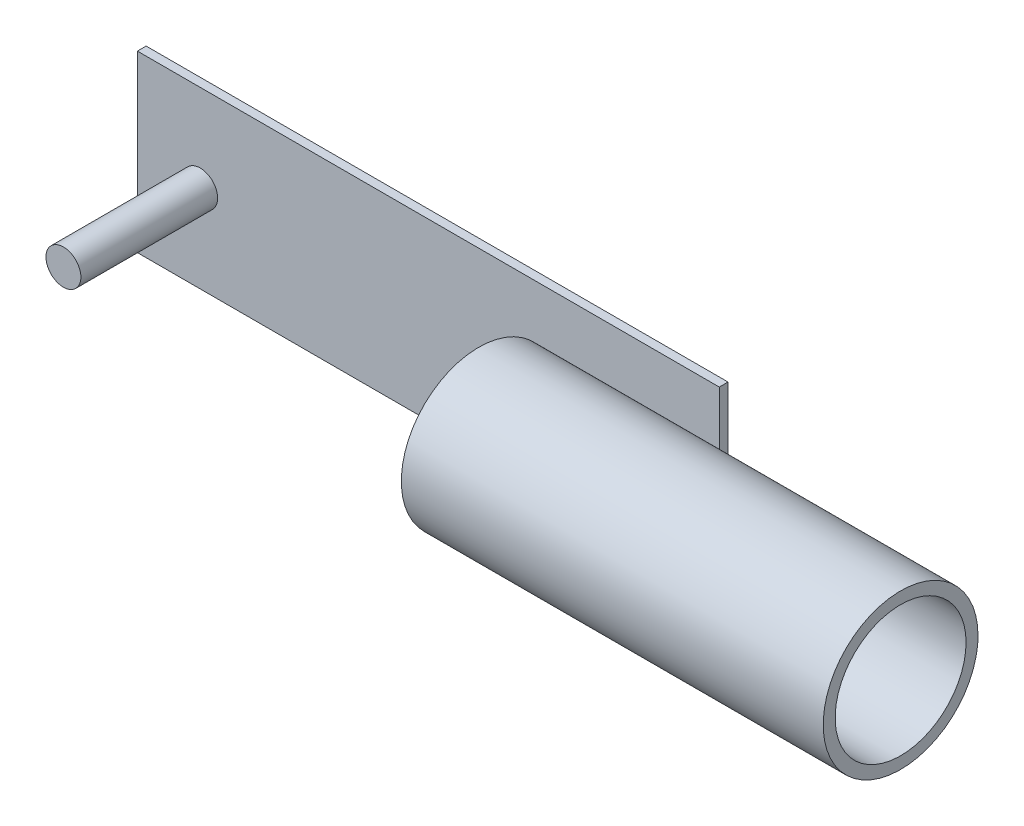
ISO-10303-21;
HEADER;
FILE_DESCRIPTION(('STEP AP214'),'2;1');
FILE_NAME('part.step','',(''),(''),'','','');
FILE_SCHEMA(('AUTOMOTIVE_DESIGN { 1 0 10303 214 1 1 1 1 }'));
ENDSEC;
DATA;
#1=APPLICATION_CONTEXT('core data for automotive mechanical design processes');
#2=APPLICATION_PROTOCOL_DEFINITION('international standard','automotive_design',2000,#1);
#3=PRODUCT_CONTEXT('',#1,'mechanical');
#4=PRODUCT('Part','Part','',(#3));
#5=PRODUCT_RELATED_PRODUCT_CATEGORY('part','',(#4));
#6=PRODUCT_DEFINITION_FORMATION('','',#4);
#7=PRODUCT_DEFINITION_CONTEXT('part definition',#1,'design');
#8=PRODUCT_DEFINITION('design','',#6,#7);
#9=PRODUCT_DEFINITION_SHAPE('','',#8);
#10=(LENGTH_UNIT() NAMED_UNIT(*) SI_UNIT(.MILLI.,.METRE.));
#11=(NAMED_UNIT(*) PLANE_ANGLE_UNIT() SI_UNIT($,.RADIAN.));
#12=(NAMED_UNIT(*) SI_UNIT($,.STERADIAN.) SOLID_ANGLE_UNIT());
#13=UNCERTAINTY_MEASURE_WITH_UNIT(LENGTH_MEASURE(1.E-05),#10,'distance_accuracy_value','');
#14=(GEOMETRIC_REPRESENTATION_CONTEXT(3) GLOBAL_UNCERTAINTY_ASSIGNED_CONTEXT((#13)) GLOBAL_UNIT_ASSIGNED_CONTEXT((#10,
#11,#12)) REPRESENTATION_CONTEXT('',''));
#15=CARTESIAN_POINT('',(0.,0.,0.));
#16=DIRECTION('',(0.,0.,1.));
#17=DIRECTION('',(1.,0.,0.));
#18=AXIS2_PLACEMENT_3D('',#15,#16,#17);
#19=CARTESIAN_POINT('',(0.,0.,3.));
#20=DIRECTION('',(0.,0.,1.));
#21=DIRECTION('',(1.,0.,0.));
#22=AXIS2_PLACEMENT_3D('',#19,#20,#21);
#23=PLANE('',#22);
#24=CARTESIAN_POINT('',(-121.602399078296,30.,3.));
#25=DIRECTION('',(0.,0.,1.));
#26=DIRECTION('',(1.,0.,0.));
#27=AXIS2_PLACEMENT_3D('',#24,#25,#26);
#28=CIRCLE('',#27,6.);
#29=CARTESIAN_POINT('',(-115.602399078296,30.,3.));
#30=VERTEX_POINT('',#29);
#31=EDGE_CURVE('E123',#30,#30,#28,.T.);
#32=ORIENTED_EDGE('',*,*,#31,.F.);
#33=EDGE_LOOP('',(#32));
#34=FACE_BOUND('',#33,.T.);
#35=DIRECTION('',(0.,1.,0.));
#36=VECTOR('',#35,1.);
#37=CARTESIAN_POINT('',(0.,0.,3.));
#38=LINE('',#37,#36);
#39=CARTESIAN_POINT('',(0.,23.5815951350507,3.));
#40=VERTEX_POINT('',#39);
#41=CARTESIAN_POINT('',(0.,35.9684115445376,3.));
#42=VERTEX_POINT('',#41);
#43=EDGE_CURVE('E46',#40,#42,#38,.T.);
#44=ORIENTED_EDGE('',*,*,#43,.T.);
#45=DIRECTION('',(-1.,0.,0.));
#46=VECTOR('',#45,1.);
#47=CARTESIAN_POINT('',(145.,35.9684115445376,3.));
#48=LINE('',#47,#46);
#49=CARTESIAN_POINT('',(56.8160935507157,35.9684115445376,3.));
#50=VERTEX_POINT('',#49);
#51=EDGE_CURVE('E11',#42,#50,#48,.F.);
#52=ORIENTED_EDGE('',*,*,#51,.T.);
#53=DIRECTION('',(0.,-1.,0.));
#54=VECTOR('',#53,1.);
#55=CARTESIAN_POINT('',(56.8160935507158,0.,3.));
#56=LINE('',#55,#54);
#57=CARTESIAN_POINT('',(56.8160935507157,60.,3.));
#58=VERTEX_POINT('',#57);
#59=EDGE_CURVE('E119',#58,#50,#56,.T.);
#60=ORIENTED_EDGE('',*,*,#59,.F.);
#61=DIRECTION('',(1.,0.,0.));
#62=VECTOR('',#61,1.);
#63=CARTESIAN_POINT('',(0.,60.,3.));
#64=LINE('',#63,#62);
#65=CARTESIAN_POINT('',(-143.183906449284,60.,3.));
#66=VERTEX_POINT('',#65);
#67=EDGE_CURVE('E141',#66,#58,#64,.T.);
#68=ORIENTED_EDGE('',*,*,#67,.F.);
#69=DIRECTION('',(0.,-1.,0.));
#70=VECTOR('',#69,1.);
#71=CARTESIAN_POINT('',(-143.183906449284,0.,3.));
#72=LINE('',#71,#70);
#73=CARTESIAN_POINT('',(-143.183906449284,0.,3.));
#74=VERTEX_POINT('',#73);
#75=EDGE_CURVE('E138',#66,#74,#72,.T.);
#76=ORIENTED_EDGE('',*,*,#75,.T.);
#77=DIRECTION('',(1.,0.,0.));
#78=VECTOR('',#77,1.);
#79=CARTESIAN_POINT('',(0.,0.,3.));
#80=LINE('',#79,#78);
#81=CARTESIAN_POINT('',(56.8160935507158,0.,3.));
#82=VERTEX_POINT('',#81);
#83=EDGE_CURVE('E135',#74,#82,#80,.T.);
#84=ORIENTED_EDGE('',*,*,#83,.T.);
#85=CARTESIAN_POINT('',(56.8160935507158,23.5815951350507,3.));
#86=VERTEX_POINT('',#85);
#87=EDGE_CURVE('E134',#86,#82,#56,.T.);
#88=ORIENTED_EDGE('',*,*,#87,.F.);
#89=DIRECTION('',(-1.,0.,0.));
#90=VECTOR('',#89,1.);
#91=CARTESIAN_POINT('',(145.,23.5815951350507,3.));
#92=LINE('',#91,#90);
#93=EDGE_CURVE('E109',#86,#40,#92,.T.);
#94=ORIENTED_EDGE('',*,*,#93,.T.);
#95=EDGE_LOOP('',(#44,#52,#60,#68,#76,#84,#88,#94));
#96=FACE_BOUND('',#95,.T.);
#97=ADVANCED_FACE('F38',(#34,#96),#23,.T.);
#98=CARTESIAN_POINT('',(0.,60.,3.));
#99=DIRECTION('',(0.,1.,0.));
#100=DIRECTION('',(0.,0.,1.));
#101=AXIS2_PLACEMENT_3D('',#98,#99,#100);
#102=PLANE('',#101);
#103=DIRECTION('',(1.,0.,0.));
#104=VECTOR('',#103,1.);
#105=CARTESIAN_POINT('',(0.,60.,0.));
#106=LINE('',#105,#104);
#107=CARTESIAN_POINT('',(-143.183906449284,60.,0.));
#108=VERTEX_POINT('',#107);
#109=CARTESIAN_POINT('',(56.8160935507157,60.,0.));
#110=VERTEX_POINT('',#109);
#111=EDGE_CURVE('E130',#108,#110,#106,.T.);
#112=ORIENTED_EDGE('',*,*,#111,.F.);
#113=DIRECTION('',(0.,0.,-1.));
#114=VECTOR('',#113,1.);
#115=CARTESIAN_POINT('',(-143.183906449284,60.,3.));
#116=LINE('',#115,#114);
#117=EDGE_CURVE('E85',#66,#108,#116,.T.);
#118=ORIENTED_EDGE('',*,*,#117,.F.);
#119=ORIENTED_EDGE('',*,*,#67,.T.);
#120=DIRECTION('',(0.,0.,-1.));
#121=VECTOR('',#120,1.);
#122=CARTESIAN_POINT('',(56.8160935507157,60.,3.));
#123=LINE('',#122,#121);
#124=EDGE_CURVE('E62',#58,#110,#123,.T.);
#125=ORIENTED_EDGE('',*,*,#124,.T.);
#126=EDGE_LOOP('',(#112,#118,#119,#125));
#127=FACE_BOUND('',#126,.T.);
#128=ADVANCED_FACE('F40',(#127),#102,.T.);
#129=CARTESIAN_POINT('',(-143.183906449284,0.,3.));
#130=DIRECTION('',(1.,0.,0.));
#131=DIRECTION('',(0.,1.,0.));
#132=AXIS2_PLACEMENT_3D('',#129,#130,#131);
#133=PLANE('',#132);
#134=DIRECTION('',(0.,-1.,0.));
#135=VECTOR('',#134,1.);
#136=CARTESIAN_POINT('',(-143.183906449284,0.,0.));
#137=LINE('',#136,#135);
#138=CARTESIAN_POINT('',(-143.183906449284,0.,0.));
#139=VERTEX_POINT('',#138);
#140=EDGE_CURVE('E127',#108,#139,#137,.T.);
#141=ORIENTED_EDGE('',*,*,#140,.T.);
#142=DIRECTION('',(0.,0.,-1.));
#143=VECTOR('',#142,1.);
#144=CARTESIAN_POINT('',(-143.183906449284,0.,3.));
#145=LINE('',#144,#143);
#146=EDGE_CURVE('E113',#74,#139,#145,.T.);
#147=ORIENTED_EDGE('',*,*,#146,.F.);
#148=ORIENTED_EDGE('',*,*,#75,.F.);
#149=ORIENTED_EDGE('',*,*,#117,.T.);
#150=EDGE_LOOP('',(#141,#147,#148,#149));
#151=FACE_BOUND('',#150,.T.);
#152=ADVANCED_FACE('F179',(#151),#133,.F.);
#153=CARTESIAN_POINT('',(0.,0.,3.));
#154=DIRECTION('',(0.,1.,0.));
#155=DIRECTION('',(0.,0.,1.));
#156=AXIS2_PLACEMENT_3D('',#153,#154,#155);
#157=PLANE('',#156);
#158=DIRECTION('',(1.,0.,0.));
#159=VECTOR('',#158,1.);
#160=CARTESIAN_POINT('',(0.,0.,0.));
#161=LINE('',#160,#159);
#162=CARTESIAN_POINT('',(56.8160935507158,0.,0.));
#163=VERTEX_POINT('',#162);
#164=EDGE_CURVE('E124',#139,#163,#161,.T.);
#165=ORIENTED_EDGE('',*,*,#164,.T.);
#166=DIRECTION('',(0.,0.,-1.));
#167=VECTOR('',#166,1.);
#168=CARTESIAN_POINT('',(56.8160935507158,0.,3.));
#169=LINE('',#168,#167);
#170=EDGE_CURVE('E116',#82,#163,#169,.T.);
#171=ORIENTED_EDGE('',*,*,#170,.F.);
#172=ORIENTED_EDGE('',*,*,#83,.F.);
#173=ORIENTED_EDGE('',*,*,#146,.T.);
#174=EDGE_LOOP('',(#165,#171,#172,#173));
#175=FACE_BOUND('',#174,.T.);
#176=ADVANCED_FACE('F190',(#175),#157,.F.);
#177=CARTESIAN_POINT('',(56.8160935507158,0.,3.));
#178=DIRECTION('',(1.,0.,0.));
#179=DIRECTION('',(0.,1.,0.));
#180=AXIS2_PLACEMENT_3D('',#177,#178,#179);
#181=PLANE('',#180);
#182=ORIENTED_EDGE('',*,*,#59,.T.);
#183=CARTESIAN_POINT('',(56.8160935507157,29.7750033397942,28.8689085840268));
#184=DIRECTION('',(1.,0.,0.));
#185=DIRECTION('',(0.,1.,0.));
#186=AXIS2_PLACEMENT_3D('',#183,#184,#185);
#187=CIRCLE('',#186,26.5999762503525);
#188=EDGE_CURVE('E97',#50,#86,#187,.F.);
#189=ORIENTED_EDGE('',*,*,#188,.T.);
#190=ORIENTED_EDGE('',*,*,#87,.T.);
#191=ORIENTED_EDGE('',*,*,#170,.T.);
#192=DIRECTION('',(0.,-1.,0.));
#193=VECTOR('',#192,1.);
#194=CARTESIAN_POINT('',(56.8160935507158,0.,0.));
#195=LINE('',#194,#193);
#196=EDGE_CURVE('E120',#110,#163,#195,.T.);
#197=ORIENTED_EDGE('',*,*,#196,.F.);
#198=ORIENTED_EDGE('',*,*,#124,.F.);
#199=EDGE_LOOP('',(#182,#189,#190,#191,#197,#198));
#200=FACE_BOUND('',#199,.T.);
#201=ADVANCED_FACE('F186',(#200),#181,.T.);
#202=CARTESIAN_POINT('',(0.,0.,0.));
#203=DIRECTION('',(0.,0.,1.));
#204=DIRECTION('',(1.,0.,0.));
#205=AXIS2_PLACEMENT_3D('',#202,#203,#204);
#206=PLANE('',#205);
#207=ORIENTED_EDGE('',*,*,#111,.T.);
#208=ORIENTED_EDGE('',*,*,#196,.T.);
#209=ORIENTED_EDGE('',*,*,#164,.F.);
#210=ORIENTED_EDGE('',*,*,#140,.F.);
#211=EDGE_LOOP('',(#207,#208,#209,#210));
#212=FACE_BOUND('',#211,.T.);
#213=ADVANCED_FACE('F183',(#212),#206,.F.);
#214=CARTESIAN_POINT('',(-121.602399078296,30.,50.));
#215=DIRECTION('',(0.,0.,-1.));
#216=DIRECTION('',(-1.,0.,0.));
#217=AXIS2_PLACEMENT_3D('',#214,#215,#216);
#218=CYLINDRICAL_SURFACE('',#217,6.);
#219=ORIENTED_EDGE('',*,*,#31,.T.);
#220=EDGE_LOOP('',(#219));
#221=FACE_BOUND('',#220,.T.);
#222=CARTESIAN_POINT('',(-121.602399078296,30.,50.));
#223=DIRECTION('',(0.,0.,1.));
#224=DIRECTION('',(1.,0.,0.));
#225=AXIS2_PLACEMENT_3D('',#222,#223,#224);
#226=CIRCLE('',#225,6.);
#227=CARTESIAN_POINT('',(-115.602399078296,30.,50.));
#228=VERTEX_POINT('',#227);
#229=EDGE_CURVE('E132',#228,#228,#226,.T.);
#230=ORIENTED_EDGE('',*,*,#229,.F.);
#231=EDGE_LOOP('',(#230));
#232=FACE_BOUND('',#231,.T.);
#233=ADVANCED_FACE('F169',(#221,#232),#218,.T.);
#234=CARTESIAN_POINT('',(0.,0.,50.));
#235=DIRECTION('',(0.,0.,1.));
#236=DIRECTION('',(1.,0.,0.));
#237=AXIS2_PLACEMENT_3D('',#234,#235,#236);
#238=PLANE('',#237);
#239=ORIENTED_EDGE('',*,*,#229,.T.);
#240=EDGE_LOOP('',(#239));
#241=FACE_BOUND('',#240,.T.);
#242=ADVANCED_FACE('F161',(#241),#238,.T.);
#243=CARTESIAN_POINT('',(145.,29.7750033397942,28.8689085840268));
#244=DIRECTION('',(1.,0.,0.));
#245=DIRECTION('',(0.,0.,-1.));
#246=AXIS2_PLACEMENT_3D('',#243,#244,#245);
#247=PLANE('',#246);
#248=CARTESIAN_POINT('',(145.,29.7750033397942,28.8689085840268));
#249=DIRECTION('',(1.,0.,0.));
#250=DIRECTION('',(0.,0.,-1.));
#251=AXIS2_PLACEMENT_3D('',#248,#249,#250);
#252=CIRCLE('',#251,26.5999762503525);
#253=CARTESIAN_POINT('',(145.,29.7750033397942,2.26893233367426));
#254=VERTEX_POINT('',#253);
#255=EDGE_CURVE('E105',#254,#254,#252,.T.);
#256=ORIENTED_EDGE('',*,*,#255,.T.);
#257=EDGE_LOOP('',(#256));
#258=FACE_BOUND('',#257,.T.);
#259=CARTESIAN_POINT('',(145.,29.7750033397942,28.8689085840268));
#260=DIRECTION('',(1.,0.,0.));
#261=DIRECTION('',(0.,0.,-1.));
#262=AXIS2_PLACEMENT_3D('',#259,#260,#261);
#263=CIRCLE('',#262,22.5);
#264=CARTESIAN_POINT('',(145.,29.7750033397942,6.3689085840268));
#265=VERTEX_POINT('',#264);
#266=EDGE_CURVE('E106',#265,#265,#263,.T.);
#267=ORIENTED_EDGE('',*,*,#266,.F.);
#268=EDGE_LOOP('',(#267));
#269=FACE_BOUND('',#268,.T.);
#270=ADVANCED_FACE('F159',(#258,#269),#247,.T.);
#271=CARTESIAN_POINT('',(0.,29.7750033397942,28.8689085840268));
#272=DIRECTION('',(1.,0.,0.));
#273=DIRECTION('',(0.,0.,-1.));
#274=AXIS2_PLACEMENT_3D('',#271,#272,#273);
#275=PLANE('',#274);
#276=ORIENTED_EDGE('',*,*,#43,.F.);
#277=CARTESIAN_POINT('',(0.,29.7750033397942,28.8689085840268));
#278=DIRECTION('',(1.,0.,0.));
#279=DIRECTION('',(0.,0.,-1.));
#280=AXIS2_PLACEMENT_3D('',#277,#278,#279);
#281=CIRCLE('',#280,26.5999762503525);
#282=EDGE_CURVE('E53',#42,#40,#281,.T.);
#283=ORIENTED_EDGE('',*,*,#282,.F.);
#284=EDGE_LOOP('',(#276,#283));
#285=FACE_BOUND('',#284,.T.);
#286=CARTESIAN_POINT('',(0.,29.7750033397942,28.8689085840268));
#287=DIRECTION('',(1.,0.,0.));
#288=DIRECTION('',(0.,0.,-1.));
#289=AXIS2_PLACEMENT_3D('',#286,#287,#288);
#290=CIRCLE('',#289,22.5);
#291=CARTESIAN_POINT('',(0.,29.7750033397942,6.3689085840268));
#292=VERTEX_POINT('',#291);
#293=EDGE_CURVE('E150',#292,#292,#290,.T.);
#294=ORIENTED_EDGE('',*,*,#293,.T.);
#295=EDGE_LOOP('',(#294));
#296=FACE_BOUND('',#295,.T.);
#297=ADVANCED_FACE('F102',(#285,#296),#275,.F.);
#298=CARTESIAN_POINT('',(145.,29.7750033397942,28.8689085840268));
#299=DIRECTION('',(-1.,0.,0.));
#300=DIRECTION('',(0.,0.,1.));
#301=AXIS2_PLACEMENT_3D('',#298,#299,#300);
#302=CYLINDRICAL_SURFACE('',#301,26.5999762503525);
#303=ORIENTED_EDGE('',*,*,#51,.F.);
#304=ORIENTED_EDGE('',*,*,#282,.T.);
#305=ORIENTED_EDGE('',*,*,#93,.F.);
#306=ORIENTED_EDGE('',*,*,#188,.F.);
#307=EDGE_LOOP('',(#303,#304,#305,#306));
#308=FACE_BOUND('',#307,.T.);
#309=ORIENTED_EDGE('',*,*,#255,.F.);
#310=EDGE_LOOP('',(#309));
#311=FACE_BOUND('',#310,.T.);
#312=ADVANCED_FACE('F94',(#308,#311),#302,.T.);
#313=CARTESIAN_POINT('',(145.,29.7750033397942,28.8689085840268));
#314=DIRECTION('',(-1.,0.,0.));
#315=DIRECTION('',(0.,0.,1.));
#316=AXIS2_PLACEMENT_3D('',#313,#314,#315);
#317=CYLINDRICAL_SURFACE('',#316,22.5);
#318=ORIENTED_EDGE('',*,*,#266,.T.);
#319=EDGE_LOOP('',(#318));
#320=FACE_BOUND('',#319,.T.);
#321=ORIENTED_EDGE('',*,*,#293,.F.);
#322=EDGE_LOOP('',(#321));
#323=FACE_BOUND('',#322,.T.);
#324=ADVANCED_FACE('F156',(#320,#323),#317,.F.);
#325=CLOSED_SHELL('',(#97,#128,#152,#176,#201,#213,#233,#242,#270,#297,#312,#324));
#326=MANIFOLD_SOLID_BREP('B2',#325);
#327=ADVANCED_BREP_SHAPE_REPRESENTATION('',(#18,#326),#14);
#328=SHAPE_DEFINITION_REPRESENTATION(#9,#327);
ENDSEC;
END-ISO-10303-21;
